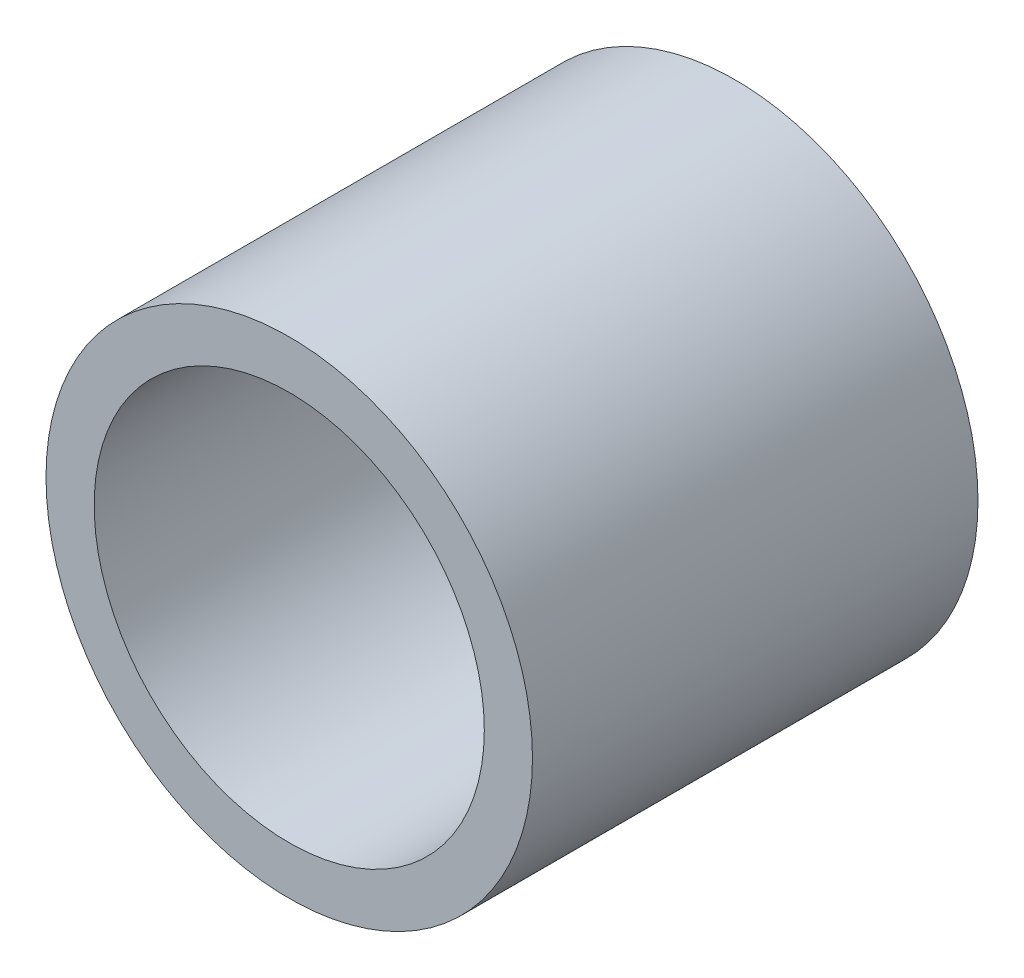
ISO-10303-21;
HEADER;
FILE_DESCRIPTION(('STEP AP214'),'2;1');
FILE_NAME('part.step','',(''),(''),'','','');
FILE_SCHEMA(('AUTOMOTIVE_DESIGN { 1 0 10303 214 1 1 1 1 }'));
ENDSEC;
DATA;
#1=APPLICATION_CONTEXT('core data for automotive mechanical design processes');
#2=APPLICATION_PROTOCOL_DEFINITION('international standard','automotive_design',2000,#1);
#3=PRODUCT_CONTEXT('',#1,'mechanical');
#4=PRODUCT('Part','Part','',(#3));
#5=PRODUCT_RELATED_PRODUCT_CATEGORY('part','',(#4));
#6=PRODUCT_DEFINITION_FORMATION('','',#4);
#7=PRODUCT_DEFINITION_CONTEXT('part definition',#1,'design');
#8=PRODUCT_DEFINITION('design','',#6,#7);
#9=PRODUCT_DEFINITION_SHAPE('','',#8);
#10=(LENGTH_UNIT() NAMED_UNIT(*) SI_UNIT(.MILLI.,.METRE.));
#11=(NAMED_UNIT(*) PLANE_ANGLE_UNIT() SI_UNIT($,.RADIAN.));
#12=(NAMED_UNIT(*) SI_UNIT($,.STERADIAN.) SOLID_ANGLE_UNIT());
#13=UNCERTAINTY_MEASURE_WITH_UNIT(LENGTH_MEASURE(1.E-05),#10,'distance_accuracy_value','');
#14=(GEOMETRIC_REPRESENTATION_CONTEXT(3) GLOBAL_UNCERTAINTY_ASSIGNED_CONTEXT((#13)) GLOBAL_UNIT_ASSIGNED_CONTEXT((#10,
#11,#12)) REPRESENTATION_CONTEXT('',''));
#15=CARTESIAN_POINT('',(0.,0.,0.));
#16=DIRECTION('',(0.,0.,1.));
#17=DIRECTION('',(1.,0.,0.));
#18=AXIS2_PLACEMENT_3D('',#15,#16,#17);
#19=CARTESIAN_POINT('',(0.,0.,9.25));
#20=DIRECTION('',(0.,0.,1.));
#21=DIRECTION('',(1.,0.,0.));
#22=AXIS2_PLACEMENT_3D('',#19,#20,#21);
#23=PLANE('',#22);
#24=CARTESIAN_POINT('',(0.,0.,9.25));
#25=DIRECTION('',(0.,0.,1.));
#26=DIRECTION('',(1.,0.,0.));
#27=AXIS2_PLACEMENT_3D('',#24,#25,#26);
#28=CIRCLE('',#27,5.05);
#29=CARTESIAN_POINT('',(5.05,0.,9.25));
#30=VERTEX_POINT('',#29);
#31=EDGE_CURVE('E11',#30,#30,#28,.T.);
#32=ORIENTED_EDGE('',*,*,#31,.T.);
#33=EDGE_LOOP('',(#32));
#34=FACE_BOUND('',#33,.T.);
#35=CARTESIAN_POINT('',(0.,0.,9.25));
#36=DIRECTION('',(0.,0.,1.));
#37=DIRECTION('',(1.,0.,0.));
#38=AXIS2_PLACEMENT_3D('',#35,#36,#37);
#39=CIRCLE('',#38,4.05);
#40=CARTESIAN_POINT('',(4.05,0.,9.25));
#41=VERTEX_POINT('',#40);
#42=EDGE_CURVE('E63',#41,#41,#39,.T.);
#43=ORIENTED_EDGE('',*,*,#42,.F.);
#44=EDGE_LOOP('',(#43));
#45=FACE_BOUND('',#44,.T.);
#46=ADVANCED_FACE('F51',(#34,#45),#23,.T.);
#47=CARTESIAN_POINT('',(0.,0.,0.));
#48=DIRECTION('',(0.,0.,1.));
#49=DIRECTION('',(1.,0.,0.));
#50=AXIS2_PLACEMENT_3D('',#47,#48,#49);
#51=PLANE('',#50);
#52=CARTESIAN_POINT('',(0.,0.,0.));
#53=DIRECTION('',(0.,0.,1.));
#54=DIRECTION('',(1.,0.,0.));
#55=AXIS2_PLACEMENT_3D('',#52,#53,#54);
#56=CIRCLE('',#55,5.05);
#57=CARTESIAN_POINT('',(5.05,0.,0.));
#58=VERTEX_POINT('',#57);
#59=EDGE_CURVE('E54',#58,#58,#56,.T.);
#60=ORIENTED_EDGE('',*,*,#59,.F.);
#61=EDGE_LOOP('',(#60));
#62=FACE_BOUND('',#61,.T.);
#63=CARTESIAN_POINT('',(0.,0.,0.));
#64=DIRECTION('',(0.,0.,1.));
#65=DIRECTION('',(1.,0.,0.));
#66=AXIS2_PLACEMENT_3D('',#63,#64,#65);
#67=CIRCLE('',#66,4.05);
#68=CARTESIAN_POINT('',(4.05,0.,0.));
#69=VERTEX_POINT('',#68);
#70=EDGE_CURVE('E66',#69,#69,#67,.T.);
#71=ORIENTED_EDGE('',*,*,#70,.T.);
#72=EDGE_LOOP('',(#71));
#73=FACE_BOUND('',#72,.T.);
#74=ADVANCED_FACE('F80',(#62,#73),#51,.F.);
#75=CARTESIAN_POINT('',(0.,0.,9.25));
#76=DIRECTION('',(0.,0.,-1.));
#77=DIRECTION('',(-1.,0.,0.));
#78=AXIS2_PLACEMENT_3D('',#75,#76,#77);
#79=CYLINDRICAL_SURFACE('',#78,5.05);
#80=ORIENTED_EDGE('',*,*,#31,.F.);
#81=EDGE_LOOP('',(#80));
#82=FACE_BOUND('',#81,.T.);
#83=ORIENTED_EDGE('',*,*,#59,.T.);
#84=EDGE_LOOP('',(#83));
#85=FACE_BOUND('',#84,.T.);
#86=ADVANCED_FACE('F52',(#82,#85),#79,.T.);
#87=CARTESIAN_POINT('',(0.,0.,9.25));
#88=DIRECTION('',(0.,0.,-1.));
#89=DIRECTION('',(-1.,0.,0.));
#90=AXIS2_PLACEMENT_3D('',#87,#88,#89);
#91=CYLINDRICAL_SURFACE('',#90,4.05);
#92=ORIENTED_EDGE('',*,*,#42,.T.);
#93=EDGE_LOOP('',(#92));
#94=FACE_BOUND('',#93,.T.);
#95=ORIENTED_EDGE('',*,*,#70,.F.);
#96=EDGE_LOOP('',(#95));
#97=FACE_BOUND('',#96,.T.);
#98=ADVANCED_FACE('F74',(#94,#97),#91,.F.);
#99=CLOSED_SHELL('',(#46,#74,#86,#98));
#100=MANIFOLD_SOLID_BREP('B2',#99);
#101=ADVANCED_BREP_SHAPE_REPRESENTATION('',(#18,#100),#14);
#102=SHAPE_DEFINITION_REPRESENTATION(#9,#101);
ENDSEC;
END-ISO-10303-21;
